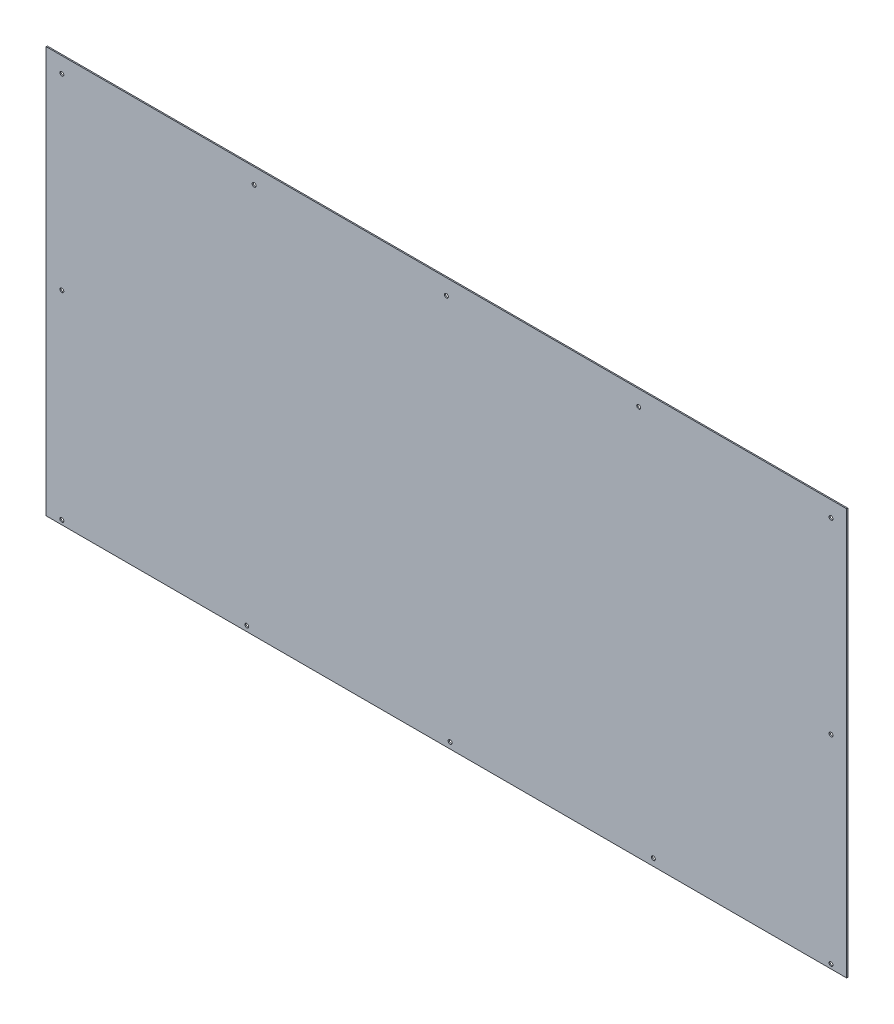
ISO-10303-21;
HEADER;
FILE_DESCRIPTION(('STEP AP214'),'2;1');
FILE_NAME('part.step','',(''),(''),'','','');
FILE_SCHEMA(('AUTOMOTIVE_DESIGN { 1 0 10303 214 1 1 1 1 }'));
ENDSEC;
DATA;
#1=APPLICATION_CONTEXT('core data for automotive mechanical design processes');
#2=APPLICATION_PROTOCOL_DEFINITION('international standard','automotive_design',2000,#1);
#3=PRODUCT_CONTEXT('',#1,'mechanical');
#4=PRODUCT('Part','Part','',(#3));
#5=PRODUCT_RELATED_PRODUCT_CATEGORY('part','',(#4));
#6=PRODUCT_DEFINITION_FORMATION('','',#4);
#7=PRODUCT_DEFINITION_CONTEXT('part definition',#1,'design');
#8=PRODUCT_DEFINITION('design','',#6,#7);
#9=PRODUCT_DEFINITION_SHAPE('','',#8);
#10=(LENGTH_UNIT() NAMED_UNIT(*) SI_UNIT(.MILLI.,.METRE.));
#11=(NAMED_UNIT(*) PLANE_ANGLE_UNIT() SI_UNIT($,.RADIAN.));
#12=(NAMED_UNIT(*) SI_UNIT($,.STERADIAN.) SOLID_ANGLE_UNIT());
#13=UNCERTAINTY_MEASURE_WITH_UNIT(LENGTH_MEASURE(1.E-05),#10,'distance_accuracy_value','');
#14=(GEOMETRIC_REPRESENTATION_CONTEXT(3) GLOBAL_UNCERTAINTY_ASSIGNED_CONTEXT((#13)) GLOBAL_UNIT_ASSIGNED_CONTEXT((#10,
#11,#12)) REPRESENTATION_CONTEXT('',''));
#15=CARTESIAN_POINT('',(0.,0.,0.));
#16=DIRECTION('',(0.,0.,1.));
#17=DIRECTION('',(1.,0.,0.));
#18=AXIS2_PLACEMENT_3D('',#15,#16,#17);
#19=CARTESIAN_POINT('',(650.,330.,1.9));
#20=DIRECTION('',(-1.,0.,0.));
#21=DIRECTION('',(0.,-1.,0.));
#22=AXIS2_PLACEMENT_3D('',#19,#20,#21);
#23=PLANE('',#22);
#24=DIRECTION('',(0.,1.,0.));
#25=VECTOR('',#24,1.);
#26=CARTESIAN_POINT('',(650.,330.,0.));
#27=LINE('',#26,#25);
#28=CARTESIAN_POINT('',(650.,-330.,0.));
#29=VERTEX_POINT('',#28);
#30=CARTESIAN_POINT('',(650.,330.,0.));
#31=VERTEX_POINT('',#30);
#32=EDGE_CURVE('E100',#29,#31,#27,.T.);
#33=ORIENTED_EDGE('',*,*,#32,.T.);
#34=DIRECTION('',(0.,0.,-1.));
#35=VECTOR('',#34,1.);
#36=CARTESIAN_POINT('',(650.,330.,1.9));
#37=LINE('',#36,#35);
#38=CARTESIAN_POINT('',(650.,330.,1.9));
#39=VERTEX_POINT('',#38);
#40=EDGE_CURVE('E11',#39,#31,#37,.T.);
#41=ORIENTED_EDGE('',*,*,#40,.F.);
#42=DIRECTION('',(0.,1.,0.));
#43=VECTOR('',#42,1.);
#44=CARTESIAN_POINT('',(650.,330.,1.9));
#45=LINE('',#44,#43);
#46=CARTESIAN_POINT('',(650.,-330.,1.9));
#47=VERTEX_POINT('',#46);
#48=EDGE_CURVE('E87',#47,#39,#45,.T.);
#49=ORIENTED_EDGE('',*,*,#48,.F.);
#50=DIRECTION('',(0.,0.,-1.));
#51=VECTOR('',#50,1.);
#52=CARTESIAN_POINT('',(650.,-330.,1.9));
#53=LINE('',#52,#51);
#54=EDGE_CURVE('E96',#47,#29,#53,.T.);
#55=ORIENTED_EDGE('',*,*,#54,.T.);
#56=EDGE_LOOP('',(#33,#41,#49,#55));
#57=FACE_BOUND('',#56,.T.);
#58=ADVANCED_FACE('F34',(#57),#23,.F.);
#59=CARTESIAN_POINT('',(-650.,330.,1.9));
#60=DIRECTION('',(0.,-1.,0.));
#61=DIRECTION('',(0.,0.,-1.));
#62=AXIS2_PLACEMENT_3D('',#59,#60,#61);
#63=PLANE('',#62);
#64=DIRECTION('',(-1.,0.,0.));
#65=VECTOR('',#64,1.);
#66=CARTESIAN_POINT('',(-650.,330.,0.));
#67=LINE('',#66,#65);
#68=CARTESIAN_POINT('',(-650.,330.,0.));
#69=VERTEX_POINT('',#68);
#70=EDGE_CURVE('E91',#31,#69,#67,.T.);
#71=ORIENTED_EDGE('',*,*,#70,.T.);
#72=DIRECTION('',(0.,0.,-1.));
#73=VECTOR('',#72,1.);
#74=CARTESIAN_POINT('',(-650.,330.,1.9));
#75=LINE('',#74,#73);
#76=CARTESIAN_POINT('',(-650.,330.,1.9));
#77=VERTEX_POINT('',#76);
#78=EDGE_CURVE('E43',#77,#69,#75,.T.);
#79=ORIENTED_EDGE('',*,*,#78,.F.);
#80=DIRECTION('',(-1.,0.,0.));
#81=VECTOR('',#80,1.);
#82=CARTESIAN_POINT('',(-650.,330.,1.9));
#83=LINE('',#82,#81);
#84=EDGE_CURVE('E82',#39,#77,#83,.T.);
#85=ORIENTED_EDGE('',*,*,#84,.F.);
#86=ORIENTED_EDGE('',*,*,#40,.T.);
#87=EDGE_LOOP('',(#71,#79,#85,#86));
#88=FACE_BOUND('',#87,.T.);
#89=ADVANCED_FACE('F90',(#88),#63,.F.);
#90=CARTESIAN_POINT('',(-650.,330.,1.9));
#91=DIRECTION('',(1.,0.,0.));
#92=DIRECTION('',(0.,1.,0.));
#93=AXIS2_PLACEMENT_3D('',#90,#91,#92);
#94=PLANE('',#93);
#95=DIRECTION('',(0.,-1.,0.));
#96=VECTOR('',#95,1.);
#97=CARTESIAN_POINT('',(-650.,330.,0.));
#98=LINE('',#97,#96);
#99=CARTESIAN_POINT('',(-650.,-330.,0.));
#100=VERTEX_POINT('',#99);
#101=EDGE_CURVE('E69',#69,#100,#98,.T.);
#102=ORIENTED_EDGE('',*,*,#101,.T.);
#103=DIRECTION('',(0.,0.,-1.));
#104=VECTOR('',#103,1.);
#105=CARTESIAN_POINT('',(-650.,-330.,1.9));
#106=LINE('',#105,#104);
#107=CARTESIAN_POINT('',(-650.,-330.,1.9));
#108=VERTEX_POINT('',#107);
#109=EDGE_CURVE('E92',#108,#100,#106,.T.);
#110=ORIENTED_EDGE('',*,*,#109,.F.);
#111=DIRECTION('',(0.,-1.,0.));
#112=VECTOR('',#111,1.);
#113=CARTESIAN_POINT('',(-650.,330.,1.9));
#114=LINE('',#113,#112);
#115=EDGE_CURVE('E85',#77,#108,#114,.T.);
#116=ORIENTED_EDGE('',*,*,#115,.F.);
#117=ORIENTED_EDGE('',*,*,#78,.T.);
#118=EDGE_LOOP('',(#102,#110,#116,#117));
#119=FACE_BOUND('',#118,.T.);
#120=ADVANCED_FACE('F94',(#119),#94,.F.);
#121=CARTESIAN_POINT('',(-650.,-330.,1.9));
#122=DIRECTION('',(0.,1.,0.));
#123=DIRECTION('',(0.,0.,1.));
#124=AXIS2_PLACEMENT_3D('',#121,#122,#123);
#125=PLANE('',#124);
#126=DIRECTION('',(1.,0.,0.));
#127=VECTOR('',#126,1.);
#128=CARTESIAN_POINT('',(-650.,-330.,0.));
#129=LINE('',#128,#127);
#130=EDGE_CURVE('E75',#100,#29,#129,.T.);
#131=ORIENTED_EDGE('',*,*,#130,.T.);
#132=ORIENTED_EDGE('',*,*,#54,.F.);
#133=DIRECTION('',(1.,0.,0.));
#134=VECTOR('',#133,1.);
#135=CARTESIAN_POINT('',(-650.,-330.,1.9));
#136=LINE('',#135,#134);
#137=EDGE_CURVE('E52',#108,#47,#136,.T.);
#138=ORIENTED_EDGE('',*,*,#137,.F.);
#139=ORIENTED_EDGE('',*,*,#109,.T.);
#140=EDGE_LOOP('',(#131,#132,#138,#139));
#141=FACE_BOUND('',#140,.T.);
#142=ADVANCED_FACE('F211',(#141),#125,.F.);
#143=CARTESIAN_POINT('',(0.,0.,1.9));
#144=DIRECTION('',(0.,0.,1.));
#145=DIRECTION('',(1.,0.,0.));
#146=AXIS2_PLACEMENT_3D('',#143,#144,#145);
#147=PLANE('',#146);
#148=CARTESIAN_POINT('',(6.0000000000001,-319.976280370379,1.9));
#149=DIRECTION('',(0.,0.,1.));
#150=DIRECTION('',(1.,0.,0.));
#151=AXIS2_PLACEMENT_3D('',#148,#149,#150);
#152=CIRCLE('',#151,3.175);
#153=CARTESIAN_POINT('',(9.1750000000001,-319.976280370379,1.9));
#154=VERTEX_POINT('',#153);
#155=EDGE_CURVE('E171',#154,#154,#152,.T.);
#156=ORIENTED_EDGE('',*,*,#155,.F.);
#157=EDGE_LOOP('',(#156));
#158=FACE_BOUND('',#157,.T.);
#159=CARTESIAN_POINT('',(336.3,-318.392495730887,1.9));
#160=DIRECTION('',(0.,0.,1.));
#161=DIRECTION('',(1.,0.,0.));
#162=AXIS2_PLACEMENT_3D('',#159,#160,#161);
#163=CIRCLE('',#162,3.17499999999997);
#164=CARTESIAN_POINT('',(339.475,-318.392495730887,1.9));
#165=VERTEX_POINT('',#164);
#166=EDGE_CURVE('E174',#165,#165,#163,.T.);
#167=ORIENTED_EDGE('',*,*,#166,.F.);
#168=EDGE_LOOP('',(#167));
#169=FACE_BOUND('',#168,.T.);
#170=CARTESIAN_POINT('',(-324.3,-321.560065009871,1.9));
#171=DIRECTION('',(0.,0.,1.));
#172=DIRECTION('',(1.,0.,0.));
#173=AXIS2_PLACEMENT_3D('',#170,#171,#172);
#174=CIRCLE('',#173,3.17499999999997);
#175=CARTESIAN_POINT('',(-321.125,-321.560065009871,1.9));
#176=VERTEX_POINT('',#175);
#177=EDGE_CURVE('E146',#176,#176,#174,.T.);
#178=ORIENTED_EDGE('',*,*,#177,.F.);
#179=EDGE_LOOP('',(#178));
#180=FACE_BOUND('',#179,.T.);
#181=CARTESIAN_POINT('',(312.3,304.6,1.9));
#182=DIRECTION('',(0.,0.,1.));
#183=DIRECTION('',(1.,0.,0.));
#184=AXIS2_PLACEMENT_3D('',#181,#182,#183);
#185=CIRCLE('',#184,3.17499999999997);
#186=CARTESIAN_POINT('',(315.475,304.6,1.9));
#187=VERTEX_POINT('',#186);
#188=EDGE_CURVE('E155',#187,#187,#185,.T.);
#189=ORIENTED_EDGE('',*,*,#188,.F.);
#190=EDGE_LOOP('',(#189));
#191=FACE_BOUND('',#190,.T.);
#192=CARTESIAN_POINT('',(-312.3,304.6,1.9));
#193=DIRECTION('',(0.,0.,1.));
#194=DIRECTION('',(1.,0.,0.));
#195=AXIS2_PLACEMENT_3D('',#192,#193,#194);
#196=CIRCLE('',#195,3.17499999999997);
#197=CARTESIAN_POINT('',(-309.125,304.6,1.9));
#198=VERTEX_POINT('',#197);
#199=EDGE_CURVE('E159',#198,#198,#196,.T.);
#200=ORIENTED_EDGE('',*,*,#199,.F.);
#201=EDGE_LOOP('',(#200));
#202=FACE_BOUND('',#201,.T.);
#203=CARTESIAN_POINT('',(0.,304.6,1.9));
#204=DIRECTION('',(0.,0.,1.));
#205=DIRECTION('',(1.,0.,0.));
#206=AXIS2_PLACEMENT_3D('',#203,#204,#205);
#207=CIRCLE('',#206,3.175);
#208=CARTESIAN_POINT('',(3.175,304.6,1.9));
#209=VERTEX_POINT('',#208);
#210=EDGE_CURVE('E156',#209,#209,#207,.T.);
#211=ORIENTED_EDGE('',*,*,#210,.F.);
#212=EDGE_LOOP('',(#211));
#213=FACE_BOUND('',#212,.T.);
#214=CARTESIAN_POINT('',(624.6,304.6,1.9));
#215=DIRECTION('',(0.,0.,1.));
#216=DIRECTION('',(-1.,0.,0.));
#217=AXIS2_PLACEMENT_3D('',#214,#215,#216);
#218=CIRCLE('',#217,3.17500000000031);
#219=CARTESIAN_POINT('',(621.425,304.6,1.9));
#220=VERTEX_POINT('',#219);
#221=EDGE_CURVE('E116',#220,#220,#218,.T.);
#222=ORIENTED_EDGE('',*,*,#221,.F.);
#223=EDGE_LOOP('',(#222));
#224=FACE_BOUND('',#223,.T.);
#225=CARTESIAN_POINT('',(-624.6,0.,1.9));
#226=DIRECTION('',(0.,0.,1.));
#227=DIRECTION('',(1.,0.,0.));
#228=AXIS2_PLACEMENT_3D('',#225,#226,#227);
#229=CIRCLE('',#228,3.17500000000008);
#230=CARTESIAN_POINT('',(-621.425,0.,1.9));
#231=VERTEX_POINT('',#230);
#232=EDGE_CURVE('E152',#231,#231,#229,.T.);
#233=ORIENTED_EDGE('',*,*,#232,.F.);
#234=EDGE_LOOP('',(#233));
#235=FACE_BOUND('',#234,.T.);
#236=CARTESIAN_POINT('',(624.6,0.,1.9));
#237=DIRECTION('',(0.,0.,1.));
#238=DIRECTION('',(-1.,0.,0.));
#239=AXIS2_PLACEMENT_3D('',#236,#237,#238);
#240=CIRCLE('',#239,3.17500000000008);
#241=CARTESIAN_POINT('',(621.425,0.,1.9));
#242=VERTEX_POINT('',#241);
#243=EDGE_CURVE('E149',#242,#242,#240,.T.);
#244=ORIENTED_EDGE('',*,*,#243,.F.);
#245=EDGE_LOOP('',(#244));
#246=FACE_BOUND('',#245,.T.);
#247=CARTESIAN_POINT('',(-624.6,-323.,1.9));
#248=DIRECTION('',(0.,0.,1.));
#249=DIRECTION('',(1.,0.,0.));
#250=AXIS2_PLACEMENT_3D('',#247,#248,#249);
#251=CIRCLE('',#250,3.17500000000008);
#252=CARTESIAN_POINT('',(-621.425,-323.,1.9));
#253=VERTEX_POINT('',#252);
#254=EDGE_CURVE('E145',#253,#253,#251,.T.);
#255=ORIENTED_EDGE('',*,*,#254,.F.);
#256=EDGE_LOOP('',(#255));
#257=FACE_BOUND('',#256,.T.);
#258=CARTESIAN_POINT('',(624.6,-323.,1.9));
#259=DIRECTION('',(0.,0.,1.));
#260=DIRECTION('',(-1.,0.,0.));
#261=AXIS2_PLACEMENT_3D('',#258,#259,#260);
#262=CIRCLE('',#261,3.17500000000008);
#263=CARTESIAN_POINT('',(621.425,-323.,1.9));
#264=VERTEX_POINT('',#263);
#265=EDGE_CURVE('E142',#264,#264,#262,.T.);
#266=ORIENTED_EDGE('',*,*,#265,.F.);
#267=EDGE_LOOP('',(#266));
#268=FACE_BOUND('',#267,.T.);
#269=CARTESIAN_POINT('',(-624.6,304.6,1.9));
#270=DIRECTION('',(0.,0.,1.));
#271=DIRECTION('',(1.,0.,0.));
#272=AXIS2_PLACEMENT_3D('',#269,#270,#271);
#273=CIRCLE('',#272,3.17500000000008);
#274=CARTESIAN_POINT('',(-621.425,304.6,1.9));
#275=VERTEX_POINT('',#274);
#276=EDGE_CURVE('E111',#275,#275,#273,.T.);
#277=ORIENTED_EDGE('',*,*,#276,.F.);
#278=EDGE_LOOP('',(#277));
#279=FACE_BOUND('',#278,.T.);
#280=ORIENTED_EDGE('',*,*,#48,.T.);
#281=ORIENTED_EDGE('',*,*,#84,.T.);
#282=ORIENTED_EDGE('',*,*,#115,.T.);
#283=ORIENTED_EDGE('',*,*,#137,.T.);
#284=EDGE_LOOP('',(#280,#281,#282,#283));
#285=FACE_BOUND('',#284,.T.);
#286=ADVANCED_FACE('F83',(#158,#169,#180,#191,#202,#213,#224,#235,#246,#257,#268,#279,#285),
#147,.T.);
#287=CARTESIAN_POINT('',(0.,0.,0.));
#288=DIRECTION('',(0.,0.,1.));
#289=DIRECTION('',(1.,0.,0.));
#290=AXIS2_PLACEMENT_3D('',#287,#288,#289);
#291=PLANE('',#290);
#292=CARTESIAN_POINT('',(6.0000000000001,-319.976280370379,0.));
#293=DIRECTION('',(0.,0.,-1.));
#294=DIRECTION('',(-1.,0.,0.));
#295=AXIS2_PLACEMENT_3D('',#292,#293,#294);
#296=CIRCLE('',#295,3.175);
#297=CARTESIAN_POINT('',(2.8250000000001,-319.976280370379,0.));
#298=VERTEX_POINT('',#297);
#299=EDGE_CURVE('E177',#298,#298,#296,.T.);
#300=ORIENTED_EDGE('',*,*,#299,.F.);
#301=EDGE_LOOP('',(#300));
#302=FACE_BOUND('',#301,.T.);
#303=CARTESIAN_POINT('',(336.3,-318.392495730887,0.));
#304=DIRECTION('',(0.,0.,-1.));
#305=DIRECTION('',(-1.,0.,0.));
#306=AXIS2_PLACEMENT_3D('',#303,#304,#305);
#307=CIRCLE('',#306,3.17499999999997);
#308=CARTESIAN_POINT('',(333.125,-318.392495730887,0.));
#309=VERTEX_POINT('',#308);
#310=EDGE_CURVE('E178',#309,#309,#307,.T.);
#311=ORIENTED_EDGE('',*,*,#310,.F.);
#312=EDGE_LOOP('',(#311));
#313=FACE_BOUND('',#312,.T.);
#314=CARTESIAN_POINT('',(-324.3,-321.560065009871,0.));
#315=DIRECTION('',(0.,0.,-1.));
#316=DIRECTION('',(-1.,0.,0.));
#317=AXIS2_PLACEMENT_3D('',#314,#315,#316);
#318=CIRCLE('',#317,3.17499999999997);
#319=CARTESIAN_POINT('',(-327.475,-321.560065009871,0.));
#320=VERTEX_POINT('',#319);
#321=EDGE_CURVE('E168',#320,#320,#318,.T.);
#322=ORIENTED_EDGE('',*,*,#321,.F.);
#323=EDGE_LOOP('',(#322));
#324=FACE_BOUND('',#323,.T.);
#325=CARTESIAN_POINT('',(312.3,304.6,0.));
#326=DIRECTION('',(0.,0.,1.));
#327=DIRECTION('',(1.,0.,0.));
#328=AXIS2_PLACEMENT_3D('',#325,#326,#327);
#329=CIRCLE('',#328,3.17499999999997);
#330=CARTESIAN_POINT('',(315.475,304.6,0.));
#331=VERTEX_POINT('',#330);
#332=EDGE_CURVE('E37',#331,#331,#329,.T.);
#333=ORIENTED_EDGE('',*,*,#332,.T.);
#334=EDGE_LOOP('',(#333));
#335=FACE_BOUND('',#334,.T.);
#336=CARTESIAN_POINT('',(-312.3,304.6,0.));
#337=DIRECTION('',(0.,0.,1.));
#338=DIRECTION('',(1.,0.,0.));
#339=AXIS2_PLACEMENT_3D('',#336,#337,#338);
#340=CIRCLE('',#339,3.17499999999997);
#341=CARTESIAN_POINT('',(-309.125,304.6,0.));
#342=VERTEX_POINT('',#341);
#343=EDGE_CURVE('E130',#342,#342,#340,.T.);
#344=ORIENTED_EDGE('',*,*,#343,.T.);
#345=EDGE_LOOP('',(#344));
#346=FACE_BOUND('',#345,.T.);
#347=CARTESIAN_POINT('',(0.,304.6,0.));
#348=DIRECTION('',(0.,0.,1.));
#349=DIRECTION('',(1.,0.,0.));
#350=AXIS2_PLACEMENT_3D('',#347,#348,#349);
#351=CIRCLE('',#350,3.175);
#352=CARTESIAN_POINT('',(3.175,304.6,0.));
#353=VERTEX_POINT('',#352);
#354=EDGE_CURVE('E128',#353,#353,#351,.T.);
#355=ORIENTED_EDGE('',*,*,#354,.T.);
#356=EDGE_LOOP('',(#355));
#357=FACE_BOUND('',#356,.T.);
#358=CARTESIAN_POINT('',(624.6,304.6,0.));
#359=DIRECTION('',(0.,0.,1.));
#360=DIRECTION('',(1.,0.,0.));
#361=AXIS2_PLACEMENT_3D('',#358,#359,#360);
#362=CIRCLE('',#361,3.17500000000031);
#363=CARTESIAN_POINT('',(627.775,304.6,0.));
#364=VERTEX_POINT('',#363);
#365=EDGE_CURVE('E125',#364,#364,#362,.T.);
#366=ORIENTED_EDGE('',*,*,#365,.T.);
#367=EDGE_LOOP('',(#366));
#368=FACE_BOUND('',#367,.T.);
#369=CARTESIAN_POINT('',(-624.6,0.,0.));
#370=DIRECTION('',(0.,0.,1.));
#371=DIRECTION('',(1.,0.,0.));
#372=AXIS2_PLACEMENT_3D('',#369,#370,#371);
#373=CIRCLE('',#372,3.17500000000008);
#374=CARTESIAN_POINT('',(-621.425,0.,0.));
#375=VERTEX_POINT('',#374);
#376=EDGE_CURVE('E122',#375,#375,#373,.T.);
#377=ORIENTED_EDGE('',*,*,#376,.T.);
#378=EDGE_LOOP('',(#377));
#379=FACE_BOUND('',#378,.T.);
#380=CARTESIAN_POINT('',(624.6,0.,0.));
#381=DIRECTION('',(0.,0.,1.));
#382=DIRECTION('',(1.,0.,0.));
#383=AXIS2_PLACEMENT_3D('',#380,#381,#382);
#384=CIRCLE('',#383,3.17500000000008);
#385=CARTESIAN_POINT('',(627.775,0.,0.));
#386=VERTEX_POINT('',#385);
#387=EDGE_CURVE('E119',#386,#386,#384,.T.);
#388=ORIENTED_EDGE('',*,*,#387,.T.);
#389=EDGE_LOOP('',(#388));
#390=FACE_BOUND('',#389,.T.);
#391=CARTESIAN_POINT('',(-624.6,-323.,0.));
#392=DIRECTION('',(0.,0.,1.));
#393=DIRECTION('',(1.,0.,0.));
#394=AXIS2_PLACEMENT_3D('',#391,#392,#393);
#395=CIRCLE('',#394,3.17500000000008);
#396=CARTESIAN_POINT('',(-621.425,-323.,0.));
#397=VERTEX_POINT('',#396);
#398=EDGE_CURVE('E115',#397,#397,#395,.T.);
#399=ORIENTED_EDGE('',*,*,#398,.T.);
#400=EDGE_LOOP('',(#399));
#401=FACE_BOUND('',#400,.T.);
#402=CARTESIAN_POINT('',(624.6,-323.,0.));
#403=DIRECTION('',(0.,0.,1.));
#404=DIRECTION('',(1.,0.,0.));
#405=AXIS2_PLACEMENT_3D('',#402,#403,#404);
#406=CIRCLE('',#405,3.17500000000008);
#407=CARTESIAN_POINT('',(627.775,-323.,0.));
#408=VERTEX_POINT('',#407);
#409=EDGE_CURVE('E112',#408,#408,#406,.T.);
#410=ORIENTED_EDGE('',*,*,#409,.T.);
#411=EDGE_LOOP('',(#410));
#412=FACE_BOUND('',#411,.T.);
#413=CARTESIAN_POINT('',(-624.6,304.6,0.));
#414=DIRECTION('',(0.,0.,1.));
#415=DIRECTION('',(1.,0.,0.));
#416=AXIS2_PLACEMENT_3D('',#413,#414,#415);
#417=CIRCLE('',#416,3.17500000000008);
#418=CARTESIAN_POINT('',(-621.425,304.6,0.));
#419=VERTEX_POINT('',#418);
#420=EDGE_CURVE('E103',#419,#419,#417,.T.);
#421=ORIENTED_EDGE('',*,*,#420,.T.);
#422=EDGE_LOOP('',(#421));
#423=FACE_BOUND('',#422,.T.);
#424=ORIENTED_EDGE('',*,*,#32,.F.);
#425=ORIENTED_EDGE('',*,*,#130,.F.);
#426=ORIENTED_EDGE('',*,*,#101,.F.);
#427=ORIENTED_EDGE('',*,*,#70,.F.);
#428=EDGE_LOOP('',(#424,#425,#426,#427));
#429=FACE_BOUND('',#428,.T.);
#430=ADVANCED_FACE('F186',(#302,#313,#324,#335,#346,#357,#368,#379,#390,#401,#412,#423,#429),
#291,.F.);
#431=CARTESIAN_POINT('',(-624.6,304.6,-4.45));
#432=DIRECTION('',(0.,0.,1.));
#433=DIRECTION('',(1.,0.,0.));
#434=AXIS2_PLACEMENT_3D('',#431,#432,#433);
#435=CYLINDRICAL_SURFACE('',#434,3.17500000000008);
#436=ORIENTED_EDGE('',*,*,#276,.T.);
#437=EDGE_LOOP('',(#436));
#438=FACE_BOUND('',#437,.T.);
#439=ORIENTED_EDGE('',*,*,#420,.F.);
#440=EDGE_LOOP('',(#439));
#441=FACE_BOUND('',#440,.T.);
#442=ADVANCED_FACE('F189',(#438,#441),#435,.F.);
#443=CARTESIAN_POINT('',(624.6,-323.,-4.45));
#444=DIRECTION('',(0.,0.,1.));
#445=DIRECTION('',(1.,0.,0.));
#446=AXIS2_PLACEMENT_3D('',#443,#444,#445);
#447=CYLINDRICAL_SURFACE('',#446,3.17500000000008);
#448=ORIENTED_EDGE('',*,*,#265,.T.);
#449=EDGE_LOOP('',(#448));
#450=FACE_BOUND('',#449,.T.);
#451=ORIENTED_EDGE('',*,*,#409,.F.);
#452=EDGE_LOOP('',(#451));
#453=FACE_BOUND('',#452,.T.);
#454=ADVANCED_FACE('F245',(#450,#453),#447,.F.);
#455=CARTESIAN_POINT('',(-624.6,-323.,-4.45));
#456=DIRECTION('',(0.,0.,1.));
#457=DIRECTION('',(1.,0.,0.));
#458=AXIS2_PLACEMENT_3D('',#455,#456,#457);
#459=CYLINDRICAL_SURFACE('',#458,3.17500000000008);
#460=ORIENTED_EDGE('',*,*,#254,.T.);
#461=EDGE_LOOP('',(#460));
#462=FACE_BOUND('',#461,.T.);
#463=ORIENTED_EDGE('',*,*,#398,.F.);
#464=EDGE_LOOP('',(#463));
#465=FACE_BOUND('',#464,.T.);
#466=ADVANCED_FACE('F255',(#462,#465),#459,.F.);
#467=CARTESIAN_POINT('',(624.6,0.,-4.45));
#468=DIRECTION('',(0.,0.,1.));
#469=DIRECTION('',(1.,0.,0.));
#470=AXIS2_PLACEMENT_3D('',#467,#468,#469);
#471=CYLINDRICAL_SURFACE('',#470,3.17500000000008);
#472=ORIENTED_EDGE('',*,*,#243,.T.);
#473=EDGE_LOOP('',(#472));
#474=FACE_BOUND('',#473,.T.);
#475=ORIENTED_EDGE('',*,*,#387,.F.);
#476=EDGE_LOOP('',(#475));
#477=FACE_BOUND('',#476,.T.);
#478=ADVANCED_FACE('F265',(#474,#477),#471,.F.);
#479=CARTESIAN_POINT('',(-624.6,0.,-4.45));
#480=DIRECTION('',(0.,0.,1.));
#481=DIRECTION('',(1.,0.,0.));
#482=AXIS2_PLACEMENT_3D('',#479,#480,#481);
#483=CYLINDRICAL_SURFACE('',#482,3.17500000000008);
#484=ORIENTED_EDGE('',*,*,#232,.T.);
#485=EDGE_LOOP('',(#484));
#486=FACE_BOUND('',#485,.T.);
#487=ORIENTED_EDGE('',*,*,#376,.F.);
#488=EDGE_LOOP('',(#487));
#489=FACE_BOUND('',#488,.T.);
#490=ADVANCED_FACE('F275',(#486,#489),#483,.F.);
#491=CARTESIAN_POINT('',(624.6,304.6,-4.45));
#492=DIRECTION('',(0.,0.,1.));
#493=DIRECTION('',(1.,0.,0.));
#494=AXIS2_PLACEMENT_3D('',#491,#492,#493);
#495=CYLINDRICAL_SURFACE('',#494,3.17500000000031);
#496=ORIENTED_EDGE('',*,*,#221,.T.);
#497=EDGE_LOOP('',(#496));
#498=FACE_BOUND('',#497,.T.);
#499=ORIENTED_EDGE('',*,*,#365,.F.);
#500=EDGE_LOOP('',(#499));
#501=FACE_BOUND('',#500,.T.);
#502=ADVANCED_FACE('F285',(#498,#501),#495,.F.);
#503=CARTESIAN_POINT('',(0.,304.6,-4.45));
#504=DIRECTION('',(0.,0.,1.));
#505=DIRECTION('',(1.,0.,0.));
#506=AXIS2_PLACEMENT_3D('',#503,#504,#505);
#507=CYLINDRICAL_SURFACE('',#506,3.175);
#508=ORIENTED_EDGE('',*,*,#210,.T.);
#509=EDGE_LOOP('',(#508));
#510=FACE_BOUND('',#509,.T.);
#511=ORIENTED_EDGE('',*,*,#354,.F.);
#512=EDGE_LOOP('',(#511));
#513=FACE_BOUND('',#512,.T.);
#514=ADVANCED_FACE('F295',(#510,#513),#507,.F.);
#515=CARTESIAN_POINT('',(-312.3,304.6,-4.45));
#516=DIRECTION('',(0.,0.,1.));
#517=DIRECTION('',(1.,0.,0.));
#518=AXIS2_PLACEMENT_3D('',#515,#516,#517);
#519=CYLINDRICAL_SURFACE('',#518,3.17499999999997);
#520=ORIENTED_EDGE('',*,*,#199,.T.);
#521=EDGE_LOOP('',(#520));
#522=FACE_BOUND('',#521,.T.);
#523=ORIENTED_EDGE('',*,*,#343,.F.);
#524=EDGE_LOOP('',(#523));
#525=FACE_BOUND('',#524,.T.);
#526=ADVANCED_FACE('F305',(#522,#525),#519,.F.);
#527=CARTESIAN_POINT('',(312.3,304.6,-4.45));
#528=DIRECTION('',(0.,0.,1.));
#529=DIRECTION('',(1.,0.,0.));
#530=AXIS2_PLACEMENT_3D('',#527,#528,#529);
#531=CYLINDRICAL_SURFACE('',#530,3.17499999999997);
#532=ORIENTED_EDGE('',*,*,#188,.T.);
#533=EDGE_LOOP('',(#532));
#534=FACE_BOUND('',#533,.T.);
#535=ORIENTED_EDGE('',*,*,#332,.F.);
#536=EDGE_LOOP('',(#535));
#537=FACE_BOUND('',#536,.T.);
#538=ADVANCED_FACE('F315',(#534,#537),#531,.F.);
#539=CARTESIAN_POINT('',(-324.3,-321.560065009871,10.));
#540=DIRECTION('',(0.,0.,-1.));
#541=DIRECTION('',(-1.,0.,0.));
#542=AXIS2_PLACEMENT_3D('',#539,#540,#541);
#543=CYLINDRICAL_SURFACE('',#542,3.17499999999997);
#544=ORIENTED_EDGE('',*,*,#177,.T.);
#545=EDGE_LOOP('',(#544));
#546=FACE_BOUND('',#545,.T.);
#547=ORIENTED_EDGE('',*,*,#321,.T.);
#548=EDGE_LOOP('',(#547));
#549=FACE_BOUND('',#548,.T.);
#550=ADVANCED_FACE('F325',(#546,#549),#543,.F.);
#551=CARTESIAN_POINT('',(336.3,-318.392495730887,10.));
#552=DIRECTION('',(0.,0.,-1.));
#553=DIRECTION('',(-1.,0.,0.));
#554=AXIS2_PLACEMENT_3D('',#551,#552,#553);
#555=CYLINDRICAL_SURFACE('',#554,3.17499999999997);
#556=ORIENTED_EDGE('',*,*,#166,.T.);
#557=EDGE_LOOP('',(#556));
#558=FACE_BOUND('',#557,.T.);
#559=ORIENTED_EDGE('',*,*,#310,.T.);
#560=EDGE_LOOP('',(#559));
#561=FACE_BOUND('',#560,.T.);
#562=ADVANCED_FACE('F345',(#558,#561),#555,.F.);
#563=CARTESIAN_POINT('',(6.0000000000001,-319.976280370379,10.));
#564=DIRECTION('',(0.,0.,-1.));
#565=DIRECTION('',(-1.,0.,0.));
#566=AXIS2_PLACEMENT_3D('',#563,#564,#565);
#567=CYLINDRICAL_SURFACE('',#566,3.175);
#568=ORIENTED_EDGE('',*,*,#155,.T.);
#569=EDGE_LOOP('',(#568));
#570=FACE_BOUND('',#569,.T.);
#571=ORIENTED_EDGE('',*,*,#299,.T.);
#572=EDGE_LOOP('',(#571));
#573=FACE_BOUND('',#572,.T.);
#574=ADVANCED_FACE('F184',(#570,#573),#567,.F.);
#575=CLOSED_SHELL('',(#58,#89,#120,#142,#286,#430,#442,#454,#466,#478,#490,#502,#514,#526,#538,
#550,#562,#574));
#576=MANIFOLD_SOLID_BREP('B2',#575);
#577=ADVANCED_BREP_SHAPE_REPRESENTATION('',(#18,#576),#14);
#578=SHAPE_DEFINITION_REPRESENTATION(#9,#577);
ENDSEC;
END-ISO-10303-21;
